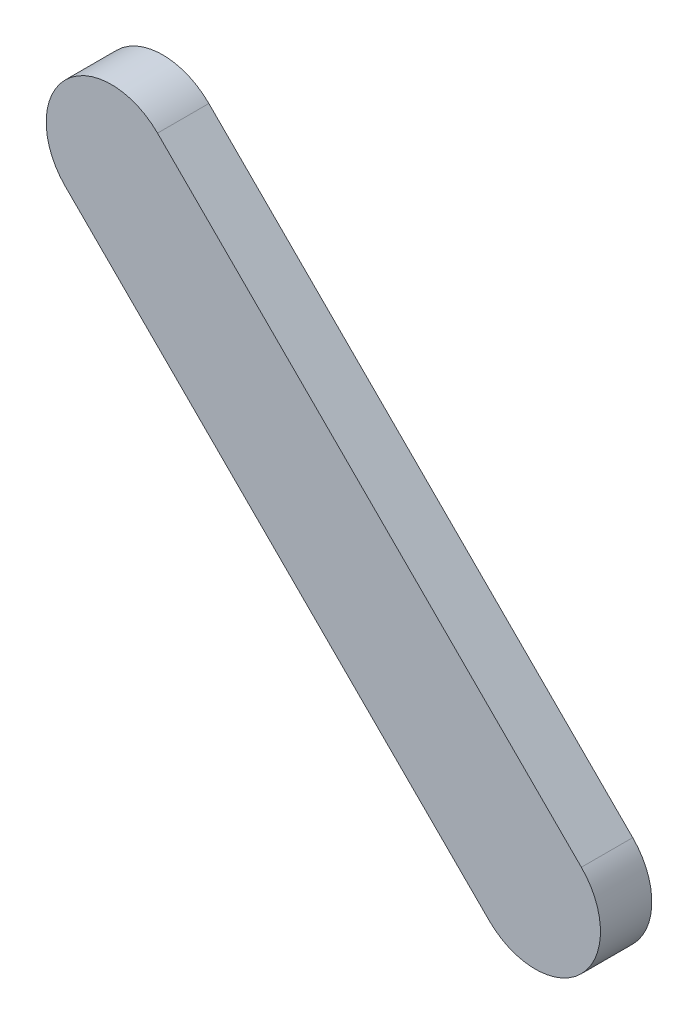
ISO-10303-21;
HEADER;
FILE_DESCRIPTION(('STEP AP214'),'2;1');
FILE_NAME('part.step','',(''),(''),'','','');
FILE_SCHEMA(('AUTOMOTIVE_DESIGN { 1 0 10303 214 1 1 1 1 }'));
ENDSEC;
DATA;
#1=APPLICATION_CONTEXT('core data for automotive mechanical design processes');
#2=APPLICATION_PROTOCOL_DEFINITION('international standard','automotive_design',2000,#1);
#3=PRODUCT_CONTEXT('',#1,'mechanical');
#4=PRODUCT('Part','Part','',(#3));
#5=PRODUCT_RELATED_PRODUCT_CATEGORY('part','',(#4));
#6=PRODUCT_DEFINITION_FORMATION('','',#4);
#7=PRODUCT_DEFINITION_CONTEXT('part definition',#1,'design');
#8=PRODUCT_DEFINITION('design','',#6,#7);
#9=PRODUCT_DEFINITION_SHAPE('','',#8);
#10=(LENGTH_UNIT() NAMED_UNIT(*) SI_UNIT(.MILLI.,.METRE.));
#11=(NAMED_UNIT(*) PLANE_ANGLE_UNIT() SI_UNIT($,.RADIAN.));
#12=(NAMED_UNIT(*) SI_UNIT($,.STERADIAN.) SOLID_ANGLE_UNIT());
#13=UNCERTAINTY_MEASURE_WITH_UNIT(LENGTH_MEASURE(1.E-05),#10,'distance_accuracy_value','');
#14=(GEOMETRIC_REPRESENTATION_CONTEXT(3) GLOBAL_UNCERTAINTY_ASSIGNED_CONTEXT((#13)) GLOBAL_UNIT_ASSIGNED_CONTEXT((#10,
#11,#12)) REPRESENTATION_CONTEXT('',''));
#15=CARTESIAN_POINT('',(0.,0.,0.));
#16=DIRECTION('',(0.,0.,1.));
#17=DIRECTION('',(1.,0.,0.));
#18=AXIS2_PLACEMENT_3D('',#15,#16,#17);
#19=CARTESIAN_POINT('',(137.9963966,85.55875954,0.));
#20=DIRECTION('',(0.707106781186551,0.707106781186544,0.));
#21=DIRECTION('',(0.707106781186544,-0.707106781186551,0.));
#22=AXIS2_PLACEMENT_3D('',#19,#20,#21);
#23=PLANE('',#22);
#24=DIRECTION('',(0.707106781186544,-0.707106781186551,0.));
#25=VECTOR('',#24,1.);
#26=CARTESIAN_POINT('',(137.9963966,85.55875954,0.1999996));
#27=LINE('',#26,#25);
#28=CARTESIAN_POINT('',(137.9963966,85.55875954,0.1999996));
#29=VERTEX_POINT('',#28);
#30=CARTESIAN_POINT('',(139.64739406,83.90776208,0.1999996));
#31=VERTEX_POINT('',#30);
#32=EDGE_CURVE('E11',#29,#31,#27,.T.);
#33=ORIENTED_EDGE('',*,*,#32,.F.);
#34=DIRECTION('',(0.,0.,1.));
#35=VECTOR('',#34,1.);
#36=CARTESIAN_POINT('',(137.9963966,85.55875954,0.));
#37=LINE('',#36,#35);
#38=CARTESIAN_POINT('',(137.9963966,85.55875954,0.));
#39=VERTEX_POINT('',#38);
#40=EDGE_CURVE('E24',#39,#29,#37,.T.);
#41=ORIENTED_EDGE('',*,*,#40,.F.);
#42=DIRECTION('',(0.707106781186544,-0.707106781186551,0.));
#43=VECTOR('',#42,1.);
#44=CARTESIAN_POINT('',(137.9963966,85.55875954,0.));
#45=LINE('',#44,#43);
#46=CARTESIAN_POINT('',(139.64739406,83.90776208,0.));
#47=VERTEX_POINT('',#46);
#48=EDGE_CURVE('E75',#39,#47,#45,.T.);
#49=ORIENTED_EDGE('',*,*,#48,.T.);
#50=DIRECTION('',(0.,0.,1.));
#51=VECTOR('',#50,1.);
#52=CARTESIAN_POINT('',(139.64739406,83.90776208,0.));
#53=LINE('',#52,#51);
#54=EDGE_CURVE('E37',#47,#31,#53,.T.);
#55=ORIENTED_EDGE('',*,*,#54,.T.);
#56=EDGE_LOOP('',(#33,#41,#49,#55));
#57=FACE_BOUND('',#56,.T.);
#58=ADVANCED_FACE('F17',(#57),#23,.F.);
#59=CARTESIAN_POINT('',(139.82699873,84.08736675,0.));
#60=DIRECTION('',(0.,0.,-1.));
#61=DIRECTION('',(-0.707106781186548,-0.707106781186548,0.));
#62=AXIS2_PLACEMENT_3D('',#59,#60,#61);
#63=CYLINDRICAL_SURFACE('',#62,0.253999360179546);
#64=CARTESIAN_POINT('',(139.82699873,84.08736675,0.1999996));
#65=DIRECTION('',(0.,0.,1.));
#66=DIRECTION('',(-0.707106781186548,-0.707106781186548,0.));
#67=AXIS2_PLACEMENT_3D('',#64,#65,#66);
#68=CIRCLE('',#67,0.253999360179546);
#69=CARTESIAN_POINT('',(140.0066034,84.26697142,0.1999996));
#70=VERTEX_POINT('',#69);
#71=EDGE_CURVE('E83',#31,#70,#68,.T.);
#72=ORIENTED_EDGE('',*,*,#71,.F.);
#73=ORIENTED_EDGE('',*,*,#54,.F.);
#74=CARTESIAN_POINT('',(139.82699873,84.08736675,0.));
#75=DIRECTION('',(0.,0.,1.));
#76=DIRECTION('',(-0.707106781186548,-0.707106781186548,0.));
#77=AXIS2_PLACEMENT_3D('',#74,#75,#76);
#78=CIRCLE('',#77,0.253999360179546);
#79=CARTESIAN_POINT('',(140.0066034,84.26697142,0.));
#80=VERTEX_POINT('',#79);
#81=EDGE_CURVE('E81',#47,#80,#78,.T.);
#82=ORIENTED_EDGE('',*,*,#81,.T.);
#83=DIRECTION('',(0.,0.,1.));
#84=VECTOR('',#83,1.);
#85=CARTESIAN_POINT('',(140.0066034,84.26697142,0.));
#86=LINE('',#85,#84);
#87=EDGE_CURVE('E67',#80,#70,#86,.T.);
#88=ORIENTED_EDGE('',*,*,#87,.T.);
#89=EDGE_LOOP('',(#72,#73,#82,#88));
#90=FACE_BOUND('',#89,.T.);
#91=ADVANCED_FACE('F89',(#90),#63,.T.);
#92=CARTESIAN_POINT('',(140.0066034,84.26697142,0.));
#93=DIRECTION('',(-0.707106781186554,-0.707106781186541,0.));
#94=DIRECTION('',(-0.707106781186541,0.707106781186554,0.));
#95=AXIS2_PLACEMENT_3D('',#92,#93,#94);
#96=PLANE('',#95);
#97=DIRECTION('',(-0.707106781186541,0.707106781186554,0.));
#98=VECTOR('',#97,1.);
#99=CARTESIAN_POINT('',(140.0066034,84.26697142,0.1999996));
#100=LINE('',#99,#98);
#101=CARTESIAN_POINT('',(138.35560594,85.91796888,0.1999996));
#102=VERTEX_POINT('',#101);
#103=EDGE_CURVE('E71',#70,#102,#100,.T.);
#104=ORIENTED_EDGE('',*,*,#103,.F.);
#105=ORIENTED_EDGE('',*,*,#87,.F.);
#106=DIRECTION('',(-0.707106781186541,0.707106781186554,0.));
#107=VECTOR('',#106,1.);
#108=CARTESIAN_POINT('',(140.0066034,84.26697142,0.));
#109=LINE('',#108,#107);
#110=CARTESIAN_POINT('',(138.35560594,85.91796888,0.));
#111=VERTEX_POINT('',#110);
#112=EDGE_CURVE('E63',#80,#111,#109,.T.);
#113=ORIENTED_EDGE('',*,*,#112,.T.);
#114=DIRECTION('',(0.,0.,1.));
#115=VECTOR('',#114,1.);
#116=CARTESIAN_POINT('',(138.35560594,85.91796888,0.));
#117=LINE('',#116,#115);
#118=EDGE_CURVE('E53',#111,#102,#117,.T.);
#119=ORIENTED_EDGE('',*,*,#118,.T.);
#120=EDGE_LOOP('',(#104,#105,#113,#119));
#121=FACE_BOUND('',#120,.T.);
#122=ADVANCED_FACE('F66',(#121),#96,.F.);
#123=CARTESIAN_POINT('',(138.17600127,85.73836421,0.));
#124=DIRECTION('',(0.,0.,-1.));
#125=DIRECTION('',(0.707106781186548,0.707106781186548,0.));
#126=AXIS2_PLACEMENT_3D('',#123,#124,#125);
#127=CYLINDRICAL_SURFACE('',#126,0.253999360179549);
#128=CARTESIAN_POINT('',(138.17600127,85.73836421,0.1999996));
#129=DIRECTION('',(0.,0.,1.));
#130=DIRECTION('',(0.707106781186548,0.707106781186548,0.));
#131=AXIS2_PLACEMENT_3D('',#128,#129,#130);
#132=CIRCLE('',#131,0.253999360179549);
#133=EDGE_CURVE('E59',#102,#29,#132,.T.);
#134=ORIENTED_EDGE('',*,*,#133,.F.);
#135=ORIENTED_EDGE('',*,*,#118,.F.);
#136=CARTESIAN_POINT('',(138.17600127,85.73836421,0.));
#137=DIRECTION('',(0.,0.,1.));
#138=DIRECTION('',(0.707106781186548,0.707106781186548,0.));
#139=AXIS2_PLACEMENT_3D('',#136,#137,#138);
#140=CIRCLE('',#139,0.253999360179549);
#141=EDGE_CURVE('E57',#111,#39,#140,.T.);
#142=ORIENTED_EDGE('',*,*,#141,.T.);
#143=ORIENTED_EDGE('',*,*,#40,.T.);
#144=EDGE_LOOP('',(#134,#135,#142,#143));
#145=FACE_BOUND('',#144,.T.);
#146=ADVANCED_FACE('F55',(#145),#127,.T.);
#147=CARTESIAN_POINT('',(137.9963966,85.55875954,0.));
#148=DIRECTION('',(0.,0.,-1.));
#149=DIRECTION('',(-1.,0.,0.));
#150=AXIS2_PLACEMENT_3D('',#147,#148,#149);
#151=PLANE('',#150);
#152=ORIENTED_EDGE('',*,*,#141,.F.);
#153=ORIENTED_EDGE('',*,*,#112,.F.);
#154=ORIENTED_EDGE('',*,*,#81,.F.);
#155=ORIENTED_EDGE('',*,*,#48,.F.);
#156=EDGE_LOOP('',(#152,#153,#154,#155));
#157=FACE_BOUND('',#156,.T.);
#158=ADVANCED_FACE('F74',(#157),#151,.T.);
#159=CARTESIAN_POINT('',(137.9963966,85.55875954,0.1999996));
#160=DIRECTION('',(0.,0.,-1.));
#161=DIRECTION('',(-1.,0.,0.));
#162=AXIS2_PLACEMENT_3D('',#159,#160,#161);
#163=PLANE('',#162);
#164=ORIENTED_EDGE('',*,*,#32,.T.);
#165=ORIENTED_EDGE('',*,*,#71,.T.);
#166=ORIENTED_EDGE('',*,*,#103,.T.);
#167=ORIENTED_EDGE('',*,*,#133,.T.);
#168=EDGE_LOOP('',(#164,#165,#166,#167));
#169=FACE_BOUND('',#168,.T.);
#170=ADVANCED_FACE('F91',(#169),#163,.F.);
#171=CLOSED_SHELL('',(#58,#91,#122,#146,#158,#170));
#172=MANIFOLD_SOLID_BREP('B1',#171);
#173=ADVANCED_BREP_SHAPE_REPRESENTATION('',(#18,#172),#14);
#174=SHAPE_DEFINITION_REPRESENTATION(#9,#173);
ENDSEC;
END-ISO-10303-21;
